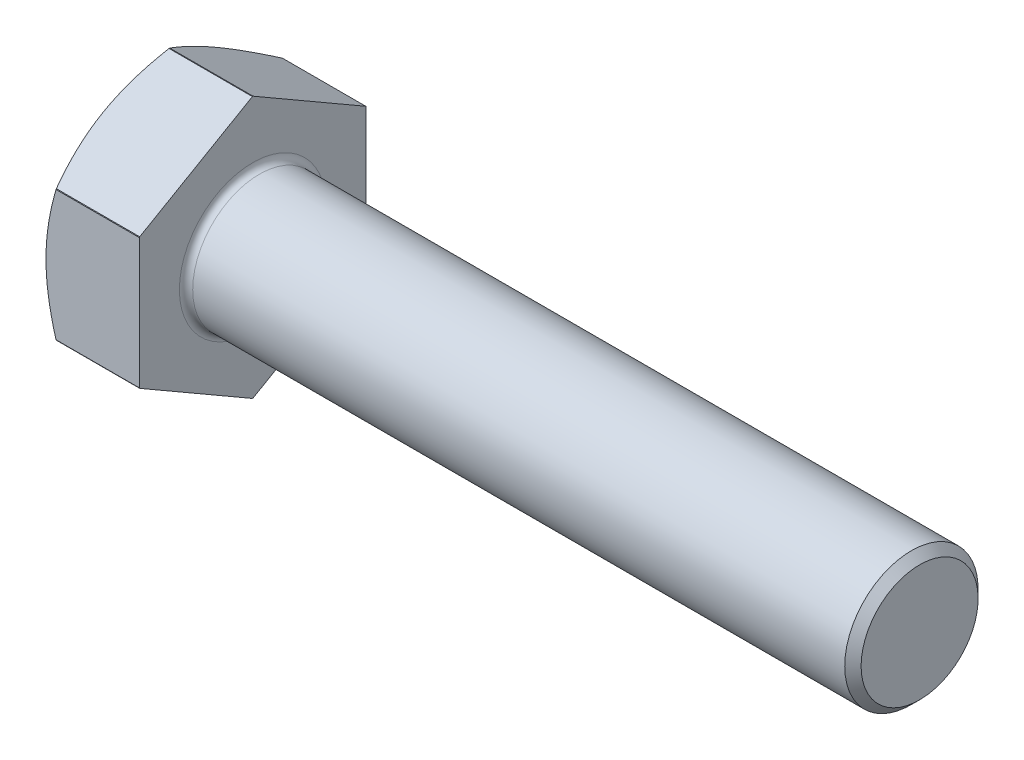
ISO-10303-21;
HEADER;
FILE_DESCRIPTION(('STEP AP214'),'2;1');
FILE_NAME('part.step','',(''),(''),'','','');
FILE_SCHEMA(('AUTOMOTIVE_DESIGN { 1 0 10303 214 1 1 1 1 }'));
ENDSEC;
DATA;
#1=APPLICATION_CONTEXT('core data for automotive mechanical design processes');
#2=APPLICATION_PROTOCOL_DEFINITION('international standard','automotive_design',2000,#1);
#3=PRODUCT_CONTEXT('',#1,'mechanical');
#4=PRODUCT('Part','Part','',(#3));
#5=PRODUCT_RELATED_PRODUCT_CATEGORY('part','',(#4));
#6=PRODUCT_DEFINITION_FORMATION('','',#4);
#7=PRODUCT_DEFINITION_CONTEXT('part definition',#1,'design');
#8=PRODUCT_DEFINITION('design','',#6,#7);
#9=PRODUCT_DEFINITION_SHAPE('','',#8);
#10=(LENGTH_UNIT() NAMED_UNIT(*) SI_UNIT(.MILLI.,.METRE.));
#11=(NAMED_UNIT(*) PLANE_ANGLE_UNIT() SI_UNIT($,.RADIAN.));
#12=(NAMED_UNIT(*) SI_UNIT($,.STERADIAN.) SOLID_ANGLE_UNIT());
#13=UNCERTAINTY_MEASURE_WITH_UNIT(LENGTH_MEASURE(1.E-05),#10,'distance_accuracy_value','');
#14=(GEOMETRIC_REPRESENTATION_CONTEXT(3) GLOBAL_UNCERTAINTY_ASSIGNED_CONTEXT((#13)) GLOBAL_UNIT_ASSIGNED_CONTEXT((#10,
#11,#12)) REPRESENTATION_CONTEXT('',''));
#15=CARTESIAN_POINT('',(0.,0.,0.));
#16=DIRECTION('',(0.,0.,1.));
#17=DIRECTION('',(1.,0.,0.));
#18=AXIS2_PLACEMENT_3D('',#15,#16,#17);
#19=CARTESIAN_POINT('',(0.,9.8,0.));
#20=DIRECTION('',(-1.,0.,0.));
#21=DIRECTION('',(0.,0.,1.));
#22=AXIS2_PLACEMENT_3D('',#19,#20,#21);
#23=PLANE('',#22);
#24=CARTESIAN_POINT('',(0.,0.,0.));
#25=DIRECTION('',(-1.,0.,0.));
#26=DIRECTION('',(0.,0.,1.));
#27=AXIS2_PLACEMENT_3D('',#24,#25,#26);
#28=CIRCLE('',#27,5.5);
#29=CARTESIAN_POINT('',(0.,0.,5.5));
#30=VERTEX_POINT('',#29);
#31=EDGE_CURVE('E166',#30,#30,#28,.T.);
#32=ORIENTED_EDGE('',*,*,#31,.T.);
#33=EDGE_LOOP('',(#32));
#34=FACE_BOUND('',#33,.T.);
#35=DIRECTION('',(0.,-0.499999999999999,0.866025403784439));
#36=VECTOR('',#35,1.);
#37=CARTESIAN_POINT('',(0.,9.8149545762236,0.));
#38=LINE('',#37,#36);
#39=CARTESIAN_POINT('',(0.,9.79996561181917,0.0259616479013193));
#40=VERTEX_POINT('',#39);
#41=CARTESIAN_POINT('',(0.,4.92246625251626,8.47403835209863));
#42=VERTEX_POINT('',#41);
#43=EDGE_CURVE('E152',#40,#42,#38,.T.);
#44=ORIENTED_EDGE('',*,*,#43,.T.);
#45=CARTESIAN_POINT('',(0.,0.,0.));
#46=DIRECTION('',(-1.,0.,0.));
#47=DIRECTION('',(0.,0.,1.));
#48=AXIS2_PLACEMENT_3D('',#45,#46,#47);
#49=CIRCLE('',#48,9.8);
#50=CARTESIAN_POINT('',(0.,4.87749935930288,8.5));
#51=VERTEX_POINT('',#50);
#52=EDGE_CURVE('E159',#51,#42,#49,.T.);
#53=ORIENTED_EDGE('',*,*,#52,.F.);
#54=DIRECTION('',(0.,-1.,0.));
#55=VECTOR('',#54,1.);
#56=CARTESIAN_POINT('',(0.,4.9074772881118,8.5));
#57=LINE('',#56,#55);
#58=CARTESIAN_POINT('',(0.,-4.87749935930288,8.5));
#59=VERTEX_POINT('',#58);
#60=EDGE_CURVE('E140',#51,#59,#57,.T.);
#61=ORIENTED_EDGE('',*,*,#60,.T.);
#62=CARTESIAN_POINT('',(0.,-4.92246625251626,8.47403835209863));
#63=VERTEX_POINT('',#62);
#64=EDGE_CURVE('E169',#63,#59,#49,.T.);
#65=ORIENTED_EDGE('',*,*,#64,.F.);
#66=DIRECTION('',(0.,-0.499999999999999,-0.866025403784439));
#67=VECTOR('',#66,1.);
#68=CARTESIAN_POINT('',(0.,-4.9074772881118,8.5));
#69=LINE('',#68,#67);
#70=CARTESIAN_POINT('',(0.,-9.79996561181917,0.0259616479013208));
#71=VERTEX_POINT('',#70);
#72=EDGE_CURVE('E151',#63,#71,#69,.T.);
#73=ORIENTED_EDGE('',*,*,#72,.T.);
#74=CARTESIAN_POINT('',(0.,-9.79996561181917,-0.0259616479013193));
#75=VERTEX_POINT('',#74);
#76=EDGE_CURVE('E176',#75,#71,#49,.T.);
#77=ORIENTED_EDGE('',*,*,#76,.F.);
#78=DIRECTION('',(0.,0.499999999999999,-0.866025403784439));
#79=VECTOR('',#78,1.);
#80=CARTESIAN_POINT('',(0.,-9.8149545762236,0.));
#81=LINE('',#80,#79);
#82=CARTESIAN_POINT('',(0.,-4.92246625251626,-8.47403835209863));
#83=VERTEX_POINT('',#82);
#84=EDGE_CURVE('E385',#75,#83,#81,.T.);
#85=ORIENTED_EDGE('',*,*,#84,.T.);
#86=CARTESIAN_POINT('',(0.,-4.87749935930288,-8.5));
#87=VERTEX_POINT('',#86);
#88=EDGE_CURVE('E180',#87,#83,#49,.T.);
#89=ORIENTED_EDGE('',*,*,#88,.F.);
#90=DIRECTION('',(0.,1.,0.));
#91=VECTOR('',#90,1.);
#92=CARTESIAN_POINT('',(0.,-4.9074772881118,-8.5));
#93=LINE('',#92,#91);
#94=CARTESIAN_POINT('',(0.,4.87749935930288,-8.5));
#95=VERTEX_POINT('',#94);
#96=EDGE_CURVE('E357',#87,#95,#93,.T.);
#97=ORIENTED_EDGE('',*,*,#96,.T.);
#98=CARTESIAN_POINT('',(0.,4.92246625251626,-8.47403835209863));
#99=VERTEX_POINT('',#98);
#100=EDGE_CURVE('E174',#99,#95,#49,.T.);
#101=ORIENTED_EDGE('',*,*,#100,.F.);
#102=DIRECTION('',(0.,0.499999999999999,0.866025403784439));
#103=VECTOR('',#102,1.);
#104=CARTESIAN_POINT('',(0.,4.9074772881118,-8.5));
#105=LINE('',#104,#103);
#106=CARTESIAN_POINT('',(0.,9.79996561181917,-0.0259616479013208));
#107=VERTEX_POINT('',#106);
#108=EDGE_CURVE('E355',#99,#107,#105,.T.);
#109=ORIENTED_EDGE('',*,*,#108,.T.);
#110=EDGE_CURVE('E167',#40,#107,#49,.T.);
#111=ORIENTED_EDGE('',*,*,#110,.F.);
#112=EDGE_LOOP('',(#44,#53,#61,#65,#73,#77,#85,#89,#97,#101,#109,#111));
#113=FACE_BOUND('',#112,.T.);
#114=ADVANCED_FACE('F34',(#34,#113),#23,.F.);
#115=CARTESIAN_POINT('',(50.,0.,0.));
#116=DIRECTION('',(-1.,0.,0.));
#117=DIRECTION('',(0.,0.,1.));
#118=AXIS2_PLACEMENT_3D('',#115,#116,#117);
#119=CYLINDRICAL_SURFACE('',#118,9.8);
#120=DIRECTION('',(-1.,0.,0.));
#121=VECTOR('',#120,1.);
#122=CARTESIAN_POINT('',(50.,9.79996561181917,0.02596164790132));
#123=LINE('',#122,#121);
#124=CARTESIAN_POINT('',(-6.2494446500535,9.79996561181917,0.0259616479013193));
#125=VERTEX_POINT('',#124);
#126=EDGE_CURVE('E206',#40,#125,#123,.T.);
#127=ORIENTED_EDGE('',*,*,#126,.F.);
#128=ORIENTED_EDGE('',*,*,#110,.T.);
#129=DIRECTION('',(-1.,0.,0.));
#130=VECTOR('',#129,1.);
#131=CARTESIAN_POINT('',(50.,9.79996561181917,-0.02596164790132));
#132=LINE('',#131,#130);
#133=CARTESIAN_POINT('',(-6.2494446500535,9.79996561181917,-0.0259616479013192));
#134=VERTEX_POINT('',#133);
#135=EDGE_CURVE('E299',#134,#107,#132,.F.);
#136=ORIENTED_EDGE('',*,*,#135,.F.);
#137=CARTESIAN_POINT('',(-6.2494446500535,0.,0.));
#138=DIRECTION('',(-1.,0.,0.));
#139=DIRECTION('',(0.,0.,1.));
#140=AXIS2_PLACEMENT_3D('',#137,#138,#139);
#141=CIRCLE('',#140,9.8);
#142=EDGE_CURVE('E181',#125,#134,#141,.T.);
#143=ORIENTED_EDGE('',*,*,#142,.F.);
#144=EDGE_LOOP('',(#127,#128,#136,#143));
#145=FACE_BOUND('',#144,.T.);
#146=ADVANCED_FACE('F249',(#145),#119,.T.);
#147=DIRECTION('',(-1.,0.,0.));
#148=VECTOR('',#147,1.);
#149=CARTESIAN_POINT('',(50.,4.92246625251626,8.47403835209863));
#150=LINE('',#149,#148);
#151=CARTESIAN_POINT('',(-6.2494446500535,4.92246625251626,8.47403835209863));
#152=VERTEX_POINT('',#151);
#153=EDGE_CURVE('E210',#152,#42,#150,.F.);
#154=ORIENTED_EDGE('',*,*,#153,.F.);
#155=CARTESIAN_POINT('',(-6.2494446500535,4.87749935930288,8.5));
#156=VERTEX_POINT('',#155);
#157=EDGE_CURVE('E161',#156,#152,#141,.T.);
#158=ORIENTED_EDGE('',*,*,#157,.F.);
#159=DIRECTION('',(-1.,0.,0.));
#160=VECTOR('',#159,1.);
#161=CARTESIAN_POINT('',(50.,4.87749935930288,8.5));
#162=LINE('',#161,#160);
#163=EDGE_CURVE('E143',#51,#156,#162,.T.);
#164=ORIENTED_EDGE('',*,*,#163,.F.);
#165=ORIENTED_EDGE('',*,*,#52,.T.);
#166=EDGE_LOOP('',(#154,#158,#164,#165));
#167=FACE_BOUND('',#166,.T.);
#168=ADVANCED_FACE('F158',(#167),#119,.T.);
#169=DIRECTION('',(-1.,0.,0.));
#170=VECTOR('',#169,1.);
#171=CARTESIAN_POINT('',(50.,4.92246625251626,-8.47403835209863));
#172=LINE('',#171,#170);
#173=CARTESIAN_POINT('',(-6.2494446500535,4.92246625251626,-8.47403835209863));
#174=VERTEX_POINT('',#173);
#175=EDGE_CURVE('E224',#99,#174,#172,.T.);
#176=ORIENTED_EDGE('',*,*,#175,.F.);
#177=ORIENTED_EDGE('',*,*,#100,.T.);
#178=DIRECTION('',(-1.,0.,0.));
#179=VECTOR('',#178,1.);
#180=CARTESIAN_POINT('',(50.,4.87749935930288,-8.5));
#181=LINE('',#180,#179);
#182=CARTESIAN_POINT('',(-6.2494446500535,4.87749935930288,-8.5));
#183=VERTEX_POINT('',#182);
#184=EDGE_CURVE('E331',#183,#95,#181,.F.);
#185=ORIENTED_EDGE('',*,*,#184,.F.);
#186=EDGE_CURVE('E186',#174,#183,#141,.T.);
#187=ORIENTED_EDGE('',*,*,#186,.F.);
#188=EDGE_LOOP('',(#176,#177,#185,#187));
#189=FACE_BOUND('',#188,.T.);
#190=ADVANCED_FACE('F397',(#189),#119,.T.);
#191=DIRECTION('',(-1.,0.,0.));
#192=VECTOR('',#191,1.);
#193=CARTESIAN_POINT('',(50.,-4.87749935930288,-8.5));
#194=LINE('',#193,#192);
#195=CARTESIAN_POINT('',(-6.2494446500535,-4.87749935930288,-8.5));
#196=VERTEX_POINT('',#195);
#197=EDGE_CURVE('E310',#87,#196,#194,.T.);
#198=ORIENTED_EDGE('',*,*,#197,.F.);
#199=ORIENTED_EDGE('',*,*,#88,.T.);
#200=DIRECTION('',(-1.,0.,0.));
#201=VECTOR('',#200,1.);
#202=CARTESIAN_POINT('',(50.,-4.92246625251626,-8.47403835209863));
#203=LINE('',#202,#201);
#204=CARTESIAN_POINT('',(-6.2494446500535,-4.92246625251626,-8.47403835209863));
#205=VERTEX_POINT('',#204);
#206=EDGE_CURVE('E381',#205,#83,#203,.F.);
#207=ORIENTED_EDGE('',*,*,#206,.F.);
#208=EDGE_CURVE('E195',#196,#205,#141,.T.);
#209=ORIENTED_EDGE('',*,*,#208,.F.);
#210=EDGE_LOOP('',(#198,#199,#207,#209));
#211=FACE_BOUND('',#210,.T.);
#212=ADVANCED_FACE('F399',(#211),#119,.T.);
#213=DIRECTION('',(-1.,0.,0.));
#214=VECTOR('',#213,1.);
#215=CARTESIAN_POINT('',(50.,-9.79996561181917,-0.02596164790132));
#216=LINE('',#215,#214);
#217=CARTESIAN_POINT('',(-6.2494446500535,-9.79996561181917,-0.0259616479013193));
#218=VERTEX_POINT('',#217);
#219=EDGE_CURVE('E329',#75,#218,#216,.T.);
#220=ORIENTED_EDGE('',*,*,#219,.F.);
#221=ORIENTED_EDGE('',*,*,#76,.T.);
#222=DIRECTION('',(-1.,0.,0.));
#223=VECTOR('',#222,1.);
#224=CARTESIAN_POINT('',(50.,-9.79996561181917,0.02596164790132));
#225=LINE('',#224,#223);
#226=CARTESIAN_POINT('',(-6.2494446500535,-9.79996561181917,0.0259616479013192));
#227=VERTEX_POINT('',#226);
#228=EDGE_CURVE('E368',#227,#71,#225,.F.);
#229=ORIENTED_EDGE('',*,*,#228,.F.);
#230=EDGE_CURVE('E189',#218,#227,#141,.T.);
#231=ORIENTED_EDGE('',*,*,#230,.F.);
#232=EDGE_LOOP('',(#220,#221,#229,#231));
#233=FACE_BOUND('',#232,.T.);
#234=ADVANCED_FACE('F294',(#233),#119,.T.);
#235=DIRECTION('',(-1.,0.,0.));
#236=VECTOR('',#235,1.);
#237=CARTESIAN_POINT('',(50.,-4.92246625251626,8.47403835209863));
#238=LINE('',#237,#236);
#239=CARTESIAN_POINT('',(-6.2494446500535,-4.92246625251626,8.47403835209863));
#240=VERTEX_POINT('',#239);
#241=EDGE_CURVE('E375',#63,#240,#238,.T.);
#242=ORIENTED_EDGE('',*,*,#241,.F.);
#243=ORIENTED_EDGE('',*,*,#64,.T.);
#244=DIRECTION('',(-1.,0.,0.));
#245=VECTOR('',#244,1.);
#246=CARTESIAN_POINT('',(50.,-4.87749935930288,8.5));
#247=LINE('',#246,#245);
#248=CARTESIAN_POINT('',(-6.2494446500535,-4.87749935930288,8.5));
#249=VERTEX_POINT('',#248);
#250=EDGE_CURVE('E146',#249,#59,#247,.F.);
#251=ORIENTED_EDGE('',*,*,#250,.F.);
#252=EDGE_CURVE('E182',#240,#249,#141,.T.);
#253=ORIENTED_EDGE('',*,*,#252,.F.);
#254=EDGE_LOOP('',(#242,#243,#251,#253));
#255=FACE_BOUND('',#254,.T.);
#256=ADVANCED_FACE('F256',(#255),#119,.T.);
#257=CARTESIAN_POINT('',(-6.2494446500535,0.,0.));
#258=DIRECTION('',(1.,0.,0.));
#259=DIRECTION('',(0.,0.,-1.));
#260=AXIS2_PLACEMENT_3D('',#257,#258,#259);
#261=CONICAL_SURFACE('',#260,9.8,1.0471975511966);
#262=CARTESIAN_POINT('',(-6.24930994250841,9.8002,0.025555675663424));
#263=CARTESIAN_POINT('',(-6.31122767769187,9.69244770105462,0.212188132069172));
#264=CARTESIAN_POINT('',(-6.37031046087963,9.58429380190872,0.399516180426547));
#265=CARTESIAN_POINT('',(-6.48202334162939,9.36712029167539,0.775671734208751));
#266=CARTESIAN_POINT('',(-6.53465131839746,9.25810040852026,0.964499710868673));
#267=CARTESIAN_POINT('',(-6.68182439318359,8.92929676906051,1.53400432012653));
#268=CARTESIAN_POINT('',(-6.76539294083317,8.70821937305391,1.91692160241498));
#269=CARTESIAN_POINT('',(-6.86313166470219,8.37738256929008,2.48994775554762));
#270=CARTESIAN_POINT('',(-6.8909241249203,8.26860158082001,2.67836195447535));
#271=CARTESIAN_POINT('',(-6.9374034163721,8.05055807942422,3.05602437715307));
#272=CARTESIAN_POINT('',(-6.95609132158574,7.94129562482763,3.24527249987405));
#273=CARTESIAN_POINT('',(-6.98388947869824,7.72258742038388,3.62408622200279));
#274=CARTESIAN_POINT('',(-6.99301031739228,7.61314200766274,3.81365123749115));
#275=CARTESIAN_POINT('',(-7.00147923075829,7.39415829271912,4.19294215780369));
#276=CARTESIAN_POINT('',(-7.00082761926562,7.28461999359259,4.38266805726553));
#277=CARTESIAN_POINT('',(-6.99053440181879,7.08080248351123,4.73569034019862));
#278=CARTESIAN_POINT('',(-6.98214787252693,6.98650691558372,4.89901505477763));
#279=CARTESIAN_POINT('',(-6.95829779220944,6.79813782818215,5.22527988473253));
#280=CARTESIAN_POINT('',(-6.94283377748633,6.70406432366306,5.38821997420566));
#281=CARTESIAN_POINT('',(-6.88618348292193,6.42221043339833,5.8764052324551));
#282=CARTESIAN_POINT('',(-6.83474611613565,6.23492627611135,6.20079090832889));
#283=CARTESIAN_POINT('',(-6.70647957598134,5.85840923096793,6.85293756043299));
#284=CARTESIAN_POINT('',(-6.62912070518856,5.66922302728264,7.18061767730699));
#285=CARTESIAN_POINT('',(-6.45367445182678,5.29362980976311,7.83116421302909));
#286=CARTESIAN_POINT('',(-6.35562679282499,5.10721819253906,8.15403860518223));
#287=CARTESIAN_POINT('',(-6.2492446500535,4.92211826298932,8.47464108763979));
#288=B_SPLINE_CURVE_WITH_KNOTS('',3,(#262,#263,#264,#265,#266,#267,#268,#269,#270,#271,#272,
#273,#274,#275,#276,#277,#278,#279,#280,#281,#282,#283,#284,#285,#286,#287),.UNSPECIFIED.,.F.,
.F.,(4,2,2,2,2,2,2,2,2,2,2,2,4),(0.,0.672615550048198,1.34545150627666,2.69393607341206,
3.35177258310565,4.00953147512439,4.66656172908547,5.32357088302731,5.88976602920824,
6.45599827625882,7.58923878134304,8.74721335905952,9.90298447302816),.UNSPECIFIED.);
#289=CARTESIAN_POINT('',(-7.,7.36121593216772,4.24999999999998));
#290=VERTEX_POINT('',#289);
#291=EDGE_CURVE('E214',#125,#290,#288,.T.);
#292=ORIENTED_EDGE('',*,*,#291,.F.);
#293=ORIENTED_EDGE('',*,*,#142,.T.);
#294=CARTESIAN_POINT('',(-6.2492446500535,4.92211826298932,-8.47464108763979));
#295=CARTESIAN_POINT('',(-6.31116507978132,5.02987147671751,-8.28800704678375));
#296=CARTESIAN_POINT('',(-6.37025062519962,5.13802629520252,-8.10067740608432));
#297=CARTESIAN_POINT('',(-6.48196915539595,5.35520166372138,-7.72451863365715));
#298=CARTESIAN_POINT('',(-6.5346000194049,5.4642224858312,-7.53568903068001));
#299=CARTESIAN_POINT('',(-6.68178196168684,5.79302904482074,-6.96617936464824));
#300=CARTESIAN_POINT('',(-6.76535665194113,6.01410846599892,-6.58325857465971));
#301=CARTESIAN_POINT('',(-6.86310457280959,6.34494840281129,-6.0102269949278));
#302=CARTESIAN_POINT('',(-6.89090005453215,6.45373041446835,-5.82181102378823));
#303=CARTESIAN_POINT('',(-6.93738535264424,6.67177602201765,-5.44414495314561));
#304=CARTESIAN_POINT('',(-6.95607624303738,6.78103955957261,-5.25489495468571));
#305=CARTESIAN_POINT('',(-6.9838802580525,6.99974998557871,-4.87607738469811));
#306=CARTESIAN_POINT('',(-6.99300397029019,7.10919653680964,-4.68651039725295));
#307=CARTESIAN_POINT('',(-7.00147844742038,7.32818259161773,-4.30721542417627));
#308=CARTESIAN_POINT('',(-7.00082952621294,7.43772209209633,-4.11748744391163));
#309=CARTESIAN_POINT('',(-6.99054119587759,7.64153965160962,-3.7644650753599));
#310=CARTESIAN_POINT('',(-6.98215706771209,7.73583406278112,-3.60114236434108));
#311=CARTESIAN_POINT('',(-6.95831189910313,7.92420088337272,-3.27488146061621));
#312=CARTESIAN_POINT('',(-6.94285039500109,8.01827327784198,-3.1119432938058));
#313=CARTESIAN_POINT('',(-6.88620772904321,8.30012390075741,-2.62376369477133));
#314=CARTESIAN_POINT('',(-6.83477557342277,8.48740596966735,-2.2993816360727));
#315=CARTESIAN_POINT('',(-6.70651950751488,8.86391888132578,-1.6472421433746));
#316=CARTESIAN_POINT('',(-6.62916590508345,9.05310304362586,-1.31956556228351));
#317=CARTESIAN_POINT('',(-6.4537299308281,9.42869229301308,-0.669025899568178));
#318=CARTESIAN_POINT('',(-6.35568728059763,9.61510198303983,-0.346154845418694));
#319=CARTESIAN_POINT('',(-6.24930994250841,9.8002,-0.0255556756634245));
#320=B_SPLINE_CURVE_WITH_KNOTS('',3,(#294,#295,#296,#297,#298,#299,#300,#301,#302,#303,#304,
#305,#306,#307,#308,#309,#310,#311,#312,#313,#314,#315,#316,#317,#318,#319),.UNSPECIFIED.,.F.,
.F.,(4,2,2,2,2,2,2,2,2,2,2,2,4),(0.,0.672623058893933,1.34546652806546,2.69396649179309,
3.35181023997751,4.00957636822933,4.66661380215189,5.32363013186964,5.88981802827564,
6.45604302253549,7.58926898511514,8.74722837832152,9.90298447134053),.UNSPECIFIED.);
#321=CARTESIAN_POINT('',(-7.,7.36121593216772,-4.24999999999998));
#322=VERTEX_POINT('',#321);
#323=EDGE_CURVE('E303',#322,#134,#320,.T.);
#324=ORIENTED_EDGE('',*,*,#323,.F.);
#325=CARTESIAN_POINT('',(-7.,0.,0.));
#326=DIRECTION('',(-1.,0.,0.));
#327=DIRECTION('',(0.,0.,1.));
#328=AXIS2_PLACEMENT_3D('',#325,#326,#327);
#329=CIRCLE('',#328,8.5);
#330=EDGE_CURVE('E197',#290,#322,#329,.T.);
#331=ORIENTED_EDGE('',*,*,#330,.F.);
#332=EDGE_LOOP('',(#292,#293,#324,#331));
#333=FACE_BOUND('',#332,.T.);
#334=ADVANCED_FACE('F226',(#333),#261,.T.);
#335=EDGE_CURVE('E217',#290,#152,#288,.T.);
#336=ORIENTED_EDGE('',*,*,#335,.F.);
#337=CARTESIAN_POINT('',(-7.,0.,8.5));
#338=VERTEX_POINT('',#337);
#339=EDGE_CURVE('E190',#338,#290,#329,.T.);
#340=ORIENTED_EDGE('',*,*,#339,.F.);
#341=CARTESIAN_POINT('',(-2.93310187004664,-13.0141554636911,8.5));
#342=CARTESIAN_POINT('',(-3.11344231038873,-12.6409667144146,8.5));
#343=CARTESIAN_POINT('',(-3.29198965144802,-12.2668954971279,8.5));
#344=CARTESIAN_POINT('',(-3.64447346565127,-11.5165109474705,8.5));
#345=CARTESIAN_POINT('',(-3.81840914019255,-11.1401972404089,8.5));
#346=CARTESIAN_POINT('',(-4.16156151599739,-10.3828171245547,8.5));
#347=CARTESIAN_POINT('',(-4.33074550513285,-10.0017358407822,8.5));
#348=CARTESIAN_POINT('',(-4.6618449037027,-9.23644074986563,8.5));
#349=CARTESIAN_POINT('',(-4.82376069211657,-8.85222710728661,8.5));
#350=CARTESIAN_POINT('',(-5.14031085365937,-8.07529173605247,8.5));
#351=CARTESIAN_POINT('',(-5.29483159331962,-7.68252345061559,8.5));
#352=CARTESIAN_POINT('',(-5.59176816653964,-6.89235475761758,8.5));
#353=CARTESIAN_POINT('',(-5.73418265319498,-6.4949538402225,8.5));
#354=CARTESIAN_POINT('',(-6.00307864597915,-5.69569935315329,8.5));
#355=CARTESIAN_POINT('',(-6.12959403599493,-5.29385730896311,8.5));
#356=CARTESIAN_POINT('',(-6.36258433707792,-4.4844750062676,8.5));
#357=CARTESIAN_POINT('',(-6.46906558688124,-4.07693659406465,8.5));
#358=CARTESIAN_POINT('',(-6.65680982275367,-3.2558146021514,8.5));
#359=CARTESIAN_POINT('',(-6.73806603038349,-2.84222942877258,8.5));
#360=CARTESIAN_POINT('',(-6.83696229574865,-2.21821329300161,8.5));
#361=CARTESIAN_POINT('',(-6.86609852241379,-2.0095759115755,8.5));
#362=CARTESIAN_POINT('',(-6.91613499152819,-1.59132338556574,8.5));
#363=CARTESIAN_POINT('',(-6.93703604928941,-1.38170833985461,8.5));
#364=CARTESIAN_POINT('',(-6.97003976469108,-0.963112848401269,8.5));
#365=CARTESIAN_POINT('',(-6.98219702712797,-0.754136725343987,8.5));
#366=CARTESIAN_POINT('',(-6.99764889484739,-0.335857184152326,8.5));
#367=CARTESIAN_POINT('',(-7.00094361509251,-0.126553770298719,8.5));
#368=CARTESIAN_POINT('',(-6.99859189748252,0.291944795044446,8.5));
#369=CARTESIAN_POINT('',(-6.99294796746044,0.501139960433452,8.5));
#370=CARTESIAN_POINT('',(-6.97285926445266,0.9191100993564,8.5));
#371=CARTESIAN_POINT('',(-6.95841405241086,1.12788505140648,8.5));
#372=CARTESIAN_POINT('',(-6.9130350931748,1.63392972703722,8.5));
#373=CARTESIAN_POINT('',(-6.8776894403969,1.93081029496678,8.5));
#374=CARTESIAN_POINT('',(-6.79116321590253,2.52229565116802,8.5));
#375=CARTESIAN_POINT('',(-6.73997832116343,2.81689979560573,8.5));
#376=CARTESIAN_POINT('',(-6.62358899019288,3.403589532692,8.5));
#377=CARTESIAN_POINT('',(-6.55837129542616,3.69567246989476,8.5));
#378=CARTESIAN_POINT('',(-6.41590616426768,4.27683284711467,8.5));
#379=CARTESIAN_POINT('',(-6.33865986127828,4.5659105675652,8.5));
#380=CARTESIAN_POINT('',(-6.17196673684966,5.14817877546845,8.5));
#381=CARTESIAN_POINT('',(-6.08226732209644,5.44129644981594,8.5));
#382=CARTESIAN_POINT('',(-5.89400822472743,6.02443351215714,8.5));
#383=CARTESIAN_POINT('',(-5.79545465435188,6.3144548851993,8.5));
#384=CARTESIAN_POINT('',(-5.59152275241049,6.89023557148376,8.5));
#385=CARTESIAN_POINT('',(-5.48618596203987,7.17600968658396,8.5));
#386=CARTESIAN_POINT('',(-5.26933135861376,7.74534092315314,8.5));
#387=CARTESIAN_POINT('',(-5.15781104638985,8.0288970945893,8.5));
#388=CARTESIAN_POINT('',(-5.04381071590475,8.31142325015993,8.5));
#389=B_SPLINE_CURVE_WITH_KNOTS('',3,(#341,#342,#343,#344,#345,#346,#347,#348,#349,#350,#351,
#352,#353,#354,#355,#356,#357,#358,#359,#360,#361,#362,#363,#364,#365,#366,#367,#368,#369,#370,
#371,#372,#373,#374,#375,#376,#377,#378,#379,#380,#381,#382,#383,#384,#385,#386,#387,#388),
.UNSPECIFIED.,.F.,.F.,(4,2,2,2,2,2,2,2,2,2,2,2,2,2,2,2,2,2,2,2,2,2,2,4),(0.,1.24345250890554,
2.48711895850737,3.73790450070648,4.98862474834104,6.25468173223562,7.52087938988065,
8.78433105753028,10.0473822984999,11.3107726516886,11.9426216042895,12.5744079857953,
13.2022137845353,13.8300114395016,14.4576329903841,15.0852858530276,15.9817179880804,
16.878395003506,17.7759229710586,18.6733664196513,19.5928023204115,20.5116083187853,
21.4252421403208,22.339247951888),.UNSPECIFIED.);
#390=EDGE_CURVE('E354',#156,#338,#389,.F.);
#391=ORIENTED_EDGE('',*,*,#390,.F.);
#392=ORIENTED_EDGE('',*,*,#157,.T.);
#393=EDGE_LOOP('',(#336,#340,#391,#392));
#394=FACE_BOUND('',#393,.T.);
#395=ADVANCED_FACE('F287',(#394),#261,.T.);
#396=EDGE_CURVE('E302',#174,#322,#320,.T.);
#397=ORIENTED_EDGE('',*,*,#396,.F.);
#398=ORIENTED_EDGE('',*,*,#186,.T.);
#399=CARTESIAN_POINT('',(-2.93310187004664,-13.0141554636911,-8.5));
#400=CARTESIAN_POINT('',(-3.11344231038873,-12.6409667144146,-8.5));
#401=CARTESIAN_POINT('',(-3.29198965144802,-12.2668954971279,-8.5));
#402=CARTESIAN_POINT('',(-3.64447346565127,-11.5165109474705,-8.5));
#403=CARTESIAN_POINT('',(-3.81840914019255,-11.1401972404089,-8.5));
#404=CARTESIAN_POINT('',(-4.16156151599739,-10.3828171245547,-8.5));
#405=CARTESIAN_POINT('',(-4.33074550513285,-10.0017358407822,-8.5));
#406=CARTESIAN_POINT('',(-4.6618449037027,-9.23644074986563,-8.5));
#407=CARTESIAN_POINT('',(-4.82376069211657,-8.85222710728661,-8.5));
#408=CARTESIAN_POINT('',(-5.14031085365937,-8.07529173605247,-8.5));
#409=CARTESIAN_POINT('',(-5.29483159331962,-7.68252345061559,-8.5));
#410=CARTESIAN_POINT('',(-5.59176816653964,-6.89235475761758,-8.5));
#411=CARTESIAN_POINT('',(-5.73418265319498,-6.4949538402225,-8.5));
#412=CARTESIAN_POINT('',(-6.00307864597915,-5.69569935315329,-8.5));
#413=CARTESIAN_POINT('',(-6.12959403599493,-5.29385730896311,-8.5));
#414=CARTESIAN_POINT('',(-6.36258433707792,-4.4844750062676,-8.5));
#415=CARTESIAN_POINT('',(-6.46906558688124,-4.07693659406465,-8.5));
#416=CARTESIAN_POINT('',(-6.65680982275367,-3.2558146021514,-8.5));
#417=CARTESIAN_POINT('',(-6.73806603038349,-2.84222942877258,-8.5));
#418=CARTESIAN_POINT('',(-6.83696229574865,-2.21821329300161,-8.5));
#419=CARTESIAN_POINT('',(-6.86609852241379,-2.0095759115755,-8.5));
#420=CARTESIAN_POINT('',(-6.91613499152819,-1.59132338556574,-8.5));
#421=CARTESIAN_POINT('',(-6.93703604928941,-1.38170833985461,-8.5));
#422=CARTESIAN_POINT('',(-6.97003976469108,-0.963112848401269,-8.5));
#423=CARTESIAN_POINT('',(-6.98219702712797,-0.754136725343987,-8.5));
#424=CARTESIAN_POINT('',(-6.99764889484739,-0.335857184152326,-8.5));
#425=CARTESIAN_POINT('',(-7.00094361509251,-0.126553770298719,-8.5));
#426=CARTESIAN_POINT('',(-6.99859189748252,0.291944795044446,-8.5));
#427=CARTESIAN_POINT('',(-6.99294796746044,0.501139960433452,-8.5));
#428=CARTESIAN_POINT('',(-6.97285926445266,0.9191100993564,-8.5));
#429=CARTESIAN_POINT('',(-6.95841405241086,1.12788505140648,-8.5));
#430=CARTESIAN_POINT('',(-6.9130350931748,1.63392972703722,-8.5));
#431=CARTESIAN_POINT('',(-6.8776894403969,1.93081029496678,-8.5));
#432=CARTESIAN_POINT('',(-6.79116321590253,2.52229565116802,-8.5));
#433=CARTESIAN_POINT('',(-6.73997832116343,2.81689979560573,-8.5));
#434=CARTESIAN_POINT('',(-6.62358899019288,3.403589532692,-8.5));
#435=CARTESIAN_POINT('',(-6.55837129542616,3.69567246989476,-8.5));
#436=CARTESIAN_POINT('',(-6.41590616426768,4.27683284711467,-8.5));
#437=CARTESIAN_POINT('',(-6.33865986127828,4.5659105675652,-8.5));
#438=CARTESIAN_POINT('',(-6.17196673684966,5.14817877546845,-8.5));
#439=CARTESIAN_POINT('',(-6.08226732209644,5.44129644981594,-8.5));
#440=CARTESIAN_POINT('',(-5.89400822472743,6.02443351215714,-8.5));
#441=CARTESIAN_POINT('',(-5.79545465435188,6.3144548851993,-8.5));
#442=CARTESIAN_POINT('',(-5.59152275241049,6.89023557148376,-8.5));
#443=CARTESIAN_POINT('',(-5.48618596203987,7.17600968658396,-8.5));
#444=CARTESIAN_POINT('',(-5.26933135861376,7.74534092315314,-8.5));
#445=CARTESIAN_POINT('',(-5.15781104638985,8.0288970945893,-8.5));
#446=CARTESIAN_POINT('',(-5.04381071590475,8.31142325015993,-8.5));
#447=B_SPLINE_CURVE_WITH_KNOTS('',3,(#399,#400,#401,#402,#403,#404,#405,#406,#407,#408,#409,
#410,#411,#412,#413,#414,#415,#416,#417,#418,#419,#420,#421,#422,#423,#424,#425,#426,#427,#428,
#429,#430,#431,#432,#433,#434,#435,#436,#437,#438,#439,#440,#441,#442,#443,#444,#445,#446),
.UNSPECIFIED.,.F.,.F.,(4,2,2,2,2,2,2,2,2,2,2,2,2,2,2,2,2,2,2,2,2,2,2,4),(0.,1.24345250890554,
2.48711895850737,3.73790450070648,4.98862474834104,6.25468173223562,7.52087938988065,
8.78433105753028,10.0473822984999,11.3107726516886,11.9426216042895,12.5744079857953,
13.2022137845353,13.8300114395016,14.4576329903841,15.0852858530276,15.9817179880804,
16.878395003506,17.7759229710586,18.6733664196513,19.5928023204115,20.5116083187853,
21.4252421403208,22.339247951888),.UNSPECIFIED.);
#448=CARTESIAN_POINT('',(-7.,0.,-8.5));
#449=VERTEX_POINT('',#448);
#450=EDGE_CURVE('E323',#449,#183,#447,.T.);
#451=ORIENTED_EDGE('',*,*,#450,.F.);
#452=EDGE_CURVE('E203',#322,#449,#329,.T.);
#453=ORIENTED_EDGE('',*,*,#452,.F.);
#454=EDGE_LOOP('',(#397,#398,#451,#453));
#455=FACE_BOUND('',#454,.T.);
#456=ADVANCED_FACE('F293',(#455),#261,.T.);
#457=EDGE_CURVE('E328',#196,#449,#447,.T.);
#458=ORIENTED_EDGE('',*,*,#457,.F.);
#459=ORIENTED_EDGE('',*,*,#208,.T.);
#460=CARTESIAN_POINT('',(-6.24930994250841,-9.8002,-0.025555675663424));
#461=CARTESIAN_POINT('',(-6.31122767769187,-9.69244770105462,-0.212188132069172));
#462=CARTESIAN_POINT('',(-6.37031046087963,-9.58429380190872,-0.399516180426547));
#463=CARTESIAN_POINT('',(-6.48202334162939,-9.36712029167539,-0.775671734208751));
#464=CARTESIAN_POINT('',(-6.53465131839746,-9.25810040852026,-0.964499710868673));
#465=CARTESIAN_POINT('',(-6.68182439318359,-8.92929676906051,-1.53400432012653));
#466=CARTESIAN_POINT('',(-6.76539294083317,-8.70821937305391,-1.91692160241498));
#467=CARTESIAN_POINT('',(-6.86313166470219,-8.37738256929008,-2.48994775554762));
#468=CARTESIAN_POINT('',(-6.8909241249203,-8.26860158082001,-2.67836195447535));
#469=CARTESIAN_POINT('',(-6.9374034163721,-8.05055807942422,-3.05602437715307));
#470=CARTESIAN_POINT('',(-6.95609132158574,-7.94129562482763,-3.24527249987405));
#471=CARTESIAN_POINT('',(-6.98388947869824,-7.72258742038388,-3.62408622200279));
#472=CARTESIAN_POINT('',(-6.99301031739228,-7.61314200766274,-3.81365123749115));
#473=CARTESIAN_POINT('',(-7.00147923075829,-7.39415829271912,-4.19294215780369));
#474=CARTESIAN_POINT('',(-7.00082761926562,-7.28461999359259,-4.38266805726553));
#475=CARTESIAN_POINT('',(-6.99053440181879,-7.08080248351123,-4.73569034019862));
#476=CARTESIAN_POINT('',(-6.98214787252693,-6.98650691558372,-4.89901505477763));
#477=CARTESIAN_POINT('',(-6.95829779220944,-6.79813782818215,-5.22527988473253));
#478=CARTESIAN_POINT('',(-6.94283377748633,-6.70406432366306,-5.38821997420566));
#479=CARTESIAN_POINT('',(-6.88618348292193,-6.42221043339833,-5.8764052324551));
#480=CARTESIAN_POINT('',(-6.83474611613565,-6.23492627611135,-6.20079090832889));
#481=CARTESIAN_POINT('',(-6.70647957598134,-5.85840923096793,-6.85293756043299));
#482=CARTESIAN_POINT('',(-6.62912070518856,-5.66922302728264,-7.18061767730699));
#483=CARTESIAN_POINT('',(-6.45367445182678,-5.29362980976311,-7.83116421302909));
#484=CARTESIAN_POINT('',(-6.35562679282499,-5.10721819253906,-8.15403860518223));
#485=CARTESIAN_POINT('',(-6.2492446500535,-4.92211826298932,-8.47464108763979));
#486=B_SPLINE_CURVE_WITH_KNOTS('',3,(#460,#461,#462,#463,#464,#465,#466,#467,#468,#469,#470,
#471,#472,#473,#474,#475,#476,#477,#478,#479,#480,#481,#482,#483,#484,#485),.UNSPECIFIED.,.F.,
.F.,(4,2,2,2,2,2,2,2,2,2,2,2,4),(0.,0.672615550048198,1.34545150627666,2.69393607341206,
3.35177258310565,4.00953147512439,4.66656172908547,5.32357088302731,5.88976602920824,
6.45599827625882,7.58923878134304,8.74721335905952,9.90298447302816),.UNSPECIFIED.);
#487=CARTESIAN_POINT('',(-7.,-7.36121593216772,-4.24999999999998));
#488=VERTEX_POINT('',#487);
#489=EDGE_CURVE('E348',#488,#205,#486,.T.);
#490=ORIENTED_EDGE('',*,*,#489,.F.);
#491=EDGE_CURVE('E209',#449,#488,#329,.T.);
#492=ORIENTED_EDGE('',*,*,#491,.F.);
#493=EDGE_LOOP('',(#458,#459,#490,#492));
#494=FACE_BOUND('',#493,.T.);
#495=ADVANCED_FACE('F284',(#494),#261,.T.);
#496=EDGE_CURVE('E57',#218,#488,#486,.T.);
#497=ORIENTED_EDGE('',*,*,#496,.F.);
#498=ORIENTED_EDGE('',*,*,#230,.T.);
#499=CARTESIAN_POINT('',(-6.2492446500535,-4.92211826298932,8.47464108763979));
#500=CARTESIAN_POINT('',(-6.31116507978132,-5.02987147671751,8.28800704678375));
#501=CARTESIAN_POINT('',(-6.37025062519962,-5.13802629520252,8.10067740608432));
#502=CARTESIAN_POINT('',(-6.48196915539595,-5.35520166372138,7.72451863365715));
#503=CARTESIAN_POINT('',(-6.5346000194049,-5.4642224858312,7.53568903068001));
#504=CARTESIAN_POINT('',(-6.68178196168684,-5.79302904482074,6.96617936464824));
#505=CARTESIAN_POINT('',(-6.76535665194113,-6.01410846599892,6.58325857465971));
#506=CARTESIAN_POINT('',(-6.86310457280959,-6.34494840281129,6.0102269949278));
#507=CARTESIAN_POINT('',(-6.89090005453215,-6.45373041446835,5.82181102378823));
#508=CARTESIAN_POINT('',(-6.93738535264424,-6.67177602201765,5.44414495314561));
#509=CARTESIAN_POINT('',(-6.95607624303738,-6.78103955957261,5.25489495468571));
#510=CARTESIAN_POINT('',(-6.9838802580525,-6.99974998557871,4.87607738469811));
#511=CARTESIAN_POINT('',(-6.99300397029019,-7.10919653680964,4.68651039725295));
#512=CARTESIAN_POINT('',(-7.00147844742038,-7.32818259161773,4.30721542417627));
#513=CARTESIAN_POINT('',(-7.00082952621294,-7.43772209209633,4.11748744391163));
#514=CARTESIAN_POINT('',(-6.99054119587759,-7.64153965160962,3.7644650753599));
#515=CARTESIAN_POINT('',(-6.98215706771209,-7.73583406278112,3.60114236434108));
#516=CARTESIAN_POINT('',(-6.95831189910313,-7.92420088337272,3.27488146061621));
#517=CARTESIAN_POINT('',(-6.94285039500109,-8.01827327784198,3.1119432938058));
#518=CARTESIAN_POINT('',(-6.88620772904321,-8.30012390075741,2.62376369477133));
#519=CARTESIAN_POINT('',(-6.83477557342277,-8.48740596966735,2.2993816360727));
#520=CARTESIAN_POINT('',(-6.70651950751488,-8.86391888132578,1.6472421433746));
#521=CARTESIAN_POINT('',(-6.62916590508345,-9.05310304362586,1.31956556228351));
#522=CARTESIAN_POINT('',(-6.4537299308281,-9.42869229301308,0.669025899568178));
#523=CARTESIAN_POINT('',(-6.35568728059763,-9.61510198303983,0.346154845418694));
#524=CARTESIAN_POINT('',(-6.24930994250841,-9.8002,0.0255556756634245));
#525=B_SPLINE_CURVE_WITH_KNOTS('',3,(#499,#500,#501,#502,#503,#504,#505,#506,#507,#508,#509,
#510,#511,#512,#513,#514,#515,#516,#517,#518,#519,#520,#521,#522,#523,#524),.UNSPECIFIED.,.F.,
.F.,(4,2,2,2,2,2,2,2,2,2,2,2,4),(0.,0.672623058893933,1.34546652806546,2.69396649179309,
3.35181023997751,4.00957636822933,4.66661380215189,5.32363013186964,5.88981802827564,
6.45604302253549,7.58926898511514,8.74722837832152,9.90298447134053),.UNSPECIFIED.);
#526=CARTESIAN_POINT('',(-7.,-7.36121593216772,4.24999999999998));
#527=VERTEX_POINT('',#526);
#528=EDGE_CURVE('E162',#527,#227,#525,.T.);
#529=ORIENTED_EDGE('',*,*,#528,.F.);
#530=EDGE_CURVE('E205',#488,#527,#329,.T.);
#531=ORIENTED_EDGE('',*,*,#530,.F.);
#532=EDGE_LOOP('',(#497,#498,#529,#531));
#533=FACE_BOUND('',#532,.T.);
#534=ADVANCED_FACE('F280',(#533),#261,.T.);
#535=EDGE_CURVE('E49',#240,#527,#525,.T.);
#536=ORIENTED_EDGE('',*,*,#535,.F.);
#537=ORIENTED_EDGE('',*,*,#252,.T.);
#538=EDGE_CURVE('E353',#338,#249,#389,.F.);
#539=ORIENTED_EDGE('',*,*,#538,.F.);
#540=EDGE_CURVE('E198',#527,#338,#329,.T.);
#541=ORIENTED_EDGE('',*,*,#540,.F.);
#542=EDGE_LOOP('',(#536,#537,#539,#541));
#543=FACE_BOUND('',#542,.T.);
#544=ADVANCED_FACE('F266',(#543),#261,.T.);
#545=CARTESIAN_POINT('',(50.,4.3865,0.));
#546=DIRECTION('',(-1.,0.,0.));
#547=DIRECTION('',(0.,0.,1.));
#548=AXIS2_PLACEMENT_3D('',#545,#546,#547);
#549=PLANE('',#548);
#550=CARTESIAN_POINT('',(50.,0.,0.));
#551=DIRECTION('',(-1.,0.,0.));
#552=DIRECTION('',(0.,0.,1.));
#553=AXIS2_PLACEMENT_3D('',#550,#551,#552);
#554=CIRCLE('',#553,4.3865);
#555=CARTESIAN_POINT('',(50.,0.,4.3865));
#556=VERTEX_POINT('',#555);
#557=EDGE_CURVE('E11',#556,#556,#554,.T.);
#558=ORIENTED_EDGE('',*,*,#557,.F.);
#559=EDGE_LOOP('',(#558));
#560=FACE_BOUND('',#559,.T.);
#561=ADVANCED_FACE('F36',(#560),#549,.F.);
#562=CARTESIAN_POINT('',(50.,0.,0.));
#563=DIRECTION('',(-1.,0.,0.));
#564=DIRECTION('',(0.,0.,1.));
#565=AXIS2_PLACEMENT_3D('',#562,#563,#564);
#566=CONICAL_SURFACE('',#565,4.3865,0.785398163397446);
#567=CARTESIAN_POINT('',(49.3865,0.,0.));
#568=DIRECTION('',(-1.,0.,0.));
#569=DIRECTION('',(0.,0.,1.));
#570=AXIS2_PLACEMENT_3D('',#567,#568,#569);
#571=CIRCLE('',#570,5.);
#572=CARTESIAN_POINT('',(49.3865,0.,5.));
#573=VERTEX_POINT('',#572);
#574=EDGE_CURVE('E42',#573,#573,#571,.T.);
#575=ORIENTED_EDGE('',*,*,#574,.F.);
#576=EDGE_LOOP('',(#575));
#577=FACE_BOUND('',#576,.T.);
#578=ORIENTED_EDGE('',*,*,#557,.T.);
#579=EDGE_LOOP('',(#578));
#580=FACE_BOUND('',#579,.T.);
#581=ADVANCED_FACE('F259',(#577,#580),#566,.T.);
#582=CARTESIAN_POINT('',(50.,0.,0.));
#583=DIRECTION('',(-1.,0.,0.));
#584=DIRECTION('',(0.,0.,1.));
#585=AXIS2_PLACEMENT_3D('',#582,#583,#584);
#586=CYLINDRICAL_SURFACE('',#585,5.);
#587=CARTESIAN_POINT('',(0.5,0.,0.));
#588=DIRECTION('',(-1.,0.,0.));
#589=DIRECTION('',(0.,0.,1.));
#590=AXIS2_PLACEMENT_3D('',#587,#588,#589);
#591=CIRCLE('',#590,5.);
#592=CARTESIAN_POINT('',(0.5,0.,5.));
#593=VERTEX_POINT('',#592);
#594=EDGE_CURVE('E171',#593,#593,#591,.T.);
#595=ORIENTED_EDGE('',*,*,#594,.F.);
#596=EDGE_LOOP('',(#595));
#597=FACE_BOUND('',#596,.T.);
#598=ORIENTED_EDGE('',*,*,#574,.T.);
#599=EDGE_LOOP('',(#598));
#600=FACE_BOUND('',#599,.T.);
#601=ADVANCED_FACE('F245',(#597,#600),#586,.T.);
#602=CARTESIAN_POINT('',(0.499999999999963,0.,0.));
#603=DIRECTION('',(-1.,0.,0.));
#604=DIRECTION('',(0.,0.,1.));
#605=AXIS2_PLACEMENT_3D('',#602,#603,#604);
#606=TOROIDAL_SURFACE('',#605,5.49999999999996,0.499999999999963);
#607=ORIENTED_EDGE('',*,*,#31,.F.);
#608=EDGE_LOOP('',(#607));
#609=FACE_BOUND('',#608,.T.);
#610=ORIENTED_EDGE('',*,*,#594,.T.);
#611=EDGE_LOOP('',(#610));
#612=FACE_BOUND('',#611,.T.);
#613=ADVANCED_FACE('F239',(#609,#612),#606,.F.);
#614=CARTESIAN_POINT('',(-7.,0.,0.));
#615=DIRECTION('',(1.,0.,0.));
#616=DIRECTION('',(0.,0.,-1.));
#617=AXIS2_PLACEMENT_3D('',#614,#615,#616);
#618=PLANE('',#617);
#619=ORIENTED_EDGE('',*,*,#339,.T.);
#620=ORIENTED_EDGE('',*,*,#330,.T.);
#621=ORIENTED_EDGE('',*,*,#452,.T.);
#622=ORIENTED_EDGE('',*,*,#491,.T.);
#623=ORIENTED_EDGE('',*,*,#530,.T.);
#624=ORIENTED_EDGE('',*,*,#540,.T.);
#625=EDGE_LOOP('',(#619,#620,#621,#622,#623,#624));
#626=FACE_BOUND('',#625,.T.);
#627=ADVANCED_FACE('F237',(#626),#618,.F.);
#628=CARTESIAN_POINT('',(-7.,4.9074772881118,8.5));
#629=DIRECTION('',(0.,0.,1.));
#630=DIRECTION('',(1.,0.,0.));
#631=AXIS2_PLACEMENT_3D('',#628,#629,#630);
#632=PLANE('',#631);
#633=ORIENTED_EDGE('',*,*,#163,.T.);
#634=ORIENTED_EDGE('',*,*,#390,.T.);
#635=ORIENTED_EDGE('',*,*,#538,.T.);
#636=ORIENTED_EDGE('',*,*,#250,.T.);
#637=ORIENTED_EDGE('',*,*,#60,.F.);
#638=EDGE_LOOP('',(#633,#634,#635,#636,#637));
#639=FACE_BOUND('',#638,.T.);
#640=ADVANCED_FACE('F142',(#639),#632,.T.);
#641=CARTESIAN_POINT('',(-7.,-4.9074772881118,8.5));
#642=DIRECTION('',(0.,-0.866025403784439,0.499999999999999));
#643=DIRECTION('',(0.,-0.499999999999999,-0.866025403784439));
#644=AXIS2_PLACEMENT_3D('',#641,#642,#643);
#645=PLANE('',#644);
#646=ORIENTED_EDGE('',*,*,#241,.T.);
#647=ORIENTED_EDGE('',*,*,#535,.T.);
#648=ORIENTED_EDGE('',*,*,#528,.T.);
#649=ORIENTED_EDGE('',*,*,#228,.T.);
#650=ORIENTED_EDGE('',*,*,#72,.F.);
#651=EDGE_LOOP('',(#646,#647,#648,#649,#650));
#652=FACE_BOUND('',#651,.T.);
#653=ADVANCED_FACE('F244',(#652),#645,.T.);
#654=CARTESIAN_POINT('',(-7.,-9.8149545762236,0.));
#655=DIRECTION('',(0.,-0.866025403784439,-0.499999999999999));
#656=DIRECTION('',(0.,0.499999999999999,-0.866025403784439));
#657=AXIS2_PLACEMENT_3D('',#654,#655,#656);
#658=PLANE('',#657);
#659=ORIENTED_EDGE('',*,*,#219,.T.);
#660=ORIENTED_EDGE('',*,*,#496,.T.);
#661=ORIENTED_EDGE('',*,*,#489,.T.);
#662=ORIENTED_EDGE('',*,*,#206,.T.);
#663=ORIENTED_EDGE('',*,*,#84,.F.);
#664=EDGE_LOOP('',(#659,#660,#661,#662,#663));
#665=FACE_BOUND('',#664,.T.);
#666=ADVANCED_FACE('F319',(#665),#658,.T.);
#667=CARTESIAN_POINT('',(-7.,-4.9074772881118,-8.5));
#668=DIRECTION('',(0.,0.,-1.));
#669=DIRECTION('',(-1.,0.,0.));
#670=AXIS2_PLACEMENT_3D('',#667,#668,#669);
#671=PLANE('',#670);
#672=ORIENTED_EDGE('',*,*,#197,.T.);
#673=ORIENTED_EDGE('',*,*,#457,.T.);
#674=ORIENTED_EDGE('',*,*,#450,.T.);
#675=ORIENTED_EDGE('',*,*,#184,.T.);
#676=ORIENTED_EDGE('',*,*,#96,.F.);
#677=EDGE_LOOP('',(#672,#673,#674,#675,#676));
#678=FACE_BOUND('',#677,.T.);
#679=ADVANCED_FACE('F315',(#678),#671,.T.);
#680=CARTESIAN_POINT('',(-7.,4.9074772881118,-8.5));
#681=DIRECTION('',(0.,0.866025403784439,-0.499999999999999));
#682=DIRECTION('',(0.,0.499999999999999,0.866025403784439));
#683=AXIS2_PLACEMENT_3D('',#680,#681,#682);
#684=PLANE('',#683);
#685=ORIENTED_EDGE('',*,*,#175,.T.);
#686=ORIENTED_EDGE('',*,*,#396,.T.);
#687=ORIENTED_EDGE('',*,*,#323,.T.);
#688=ORIENTED_EDGE('',*,*,#135,.T.);
#689=ORIENTED_EDGE('',*,*,#108,.F.);
#690=EDGE_LOOP('',(#685,#686,#687,#688,#689));
#691=FACE_BOUND('',#690,.T.);
#692=ADVANCED_FACE('F234',(#691),#684,.T.);
#693=CARTESIAN_POINT('',(-7.,9.8149545762236,0.));
#694=DIRECTION('',(0.,0.866025403784439,0.499999999999999));
#695=DIRECTION('',(0.,-0.499999999999999,0.866025403784439));
#696=AXIS2_PLACEMENT_3D('',#693,#694,#695);
#697=PLANE('',#696);
#698=ORIENTED_EDGE('',*,*,#126,.T.);
#699=ORIENTED_EDGE('',*,*,#291,.T.);
#700=ORIENTED_EDGE('',*,*,#335,.T.);
#701=ORIENTED_EDGE('',*,*,#153,.T.);
#702=ORIENTED_EDGE('',*,*,#43,.F.);
#703=EDGE_LOOP('',(#698,#699,#700,#701,#702));
#704=FACE_BOUND('',#703,.T.);
#705=ADVANCED_FACE('F230',(#704),#697,.T.);
#706=CLOSED_SHELL('',(#114,#146,#168,#190,#212,#234,#256,#334,#395,#456,#495,#534,#544,#561,
#581,#601,#613,#627,#640,#653,#666,#679,#692,#705));
#707=MANIFOLD_SOLID_BREP('B2',#706);
#708=ADVANCED_BREP_SHAPE_REPRESENTATION('',(#18,#707),#14);
#709=SHAPE_DEFINITION_REPRESENTATION(#9,#708);
ENDSEC;
END-ISO-10303-21;
